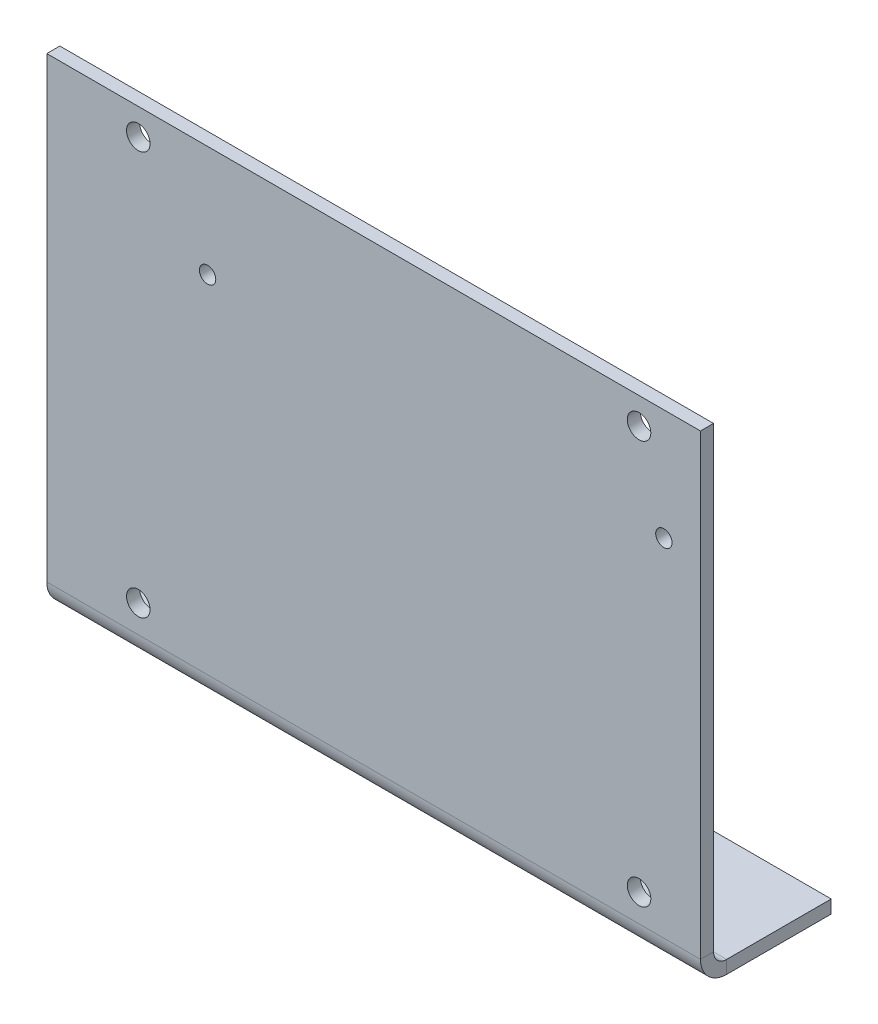
ISO-10303-21;
HEADER;
FILE_DESCRIPTION(('STEP AP214'),'2;1');
FILE_NAME('part.step','',(''),(''),'','','');
FILE_SCHEMA(('AUTOMOTIVE_DESIGN { 1 0 10303 214 1 1 1 1 }'));
ENDSEC;
DATA;
#1=APPLICATION_CONTEXT('core data for automotive mechanical design processes');
#2=APPLICATION_PROTOCOL_DEFINITION('international standard','automotive_design',2000,#1);
#3=PRODUCT_CONTEXT('',#1,'mechanical');
#4=PRODUCT('Part','Part','',(#3));
#5=PRODUCT_RELATED_PRODUCT_CATEGORY('part','',(#4));
#6=PRODUCT_DEFINITION_FORMATION('','',#4);
#7=PRODUCT_DEFINITION_CONTEXT('part definition',#1,'design');
#8=PRODUCT_DEFINITION('design','',#6,#7);
#9=PRODUCT_DEFINITION_SHAPE('','',#8);
#10=(LENGTH_UNIT() NAMED_UNIT(*) SI_UNIT(.MILLI.,.METRE.));
#11=(NAMED_UNIT(*) PLANE_ANGLE_UNIT() SI_UNIT($,.RADIAN.));
#12=(NAMED_UNIT(*) SI_UNIT($,.STERADIAN.) SOLID_ANGLE_UNIT());
#13=UNCERTAINTY_MEASURE_WITH_UNIT(LENGTH_MEASURE(1.E-05),#10,'distance_accuracy_value','');
#14=(GEOMETRIC_REPRESENTATION_CONTEXT(3) GLOBAL_UNCERTAINTY_ASSIGNED_CONTEXT((#13)) GLOBAL_UNIT_ASSIGNED_CONTEXT((#10,
#11,#12)) REPRESENTATION_CONTEXT('',''));
#15=CARTESIAN_POINT('',(0.,0.,0.));
#16=DIRECTION('',(0.,0.,1.));
#17=DIRECTION('',(1.,0.,0.));
#18=AXIS2_PLACEMENT_3D('',#15,#16,#17);
#19=CARTESIAN_POINT('',(0.,0.,10.));
#20=DIRECTION('',(0.,0.,-1.));
#21=DIRECTION('',(-1.,0.,0.));
#22=AXIS2_PLACEMENT_3D('',#19,#20,#21);
#23=PLANE('',#22);
#24=CARTESIAN_POINT('',(-35.9999999999997,67.9350000000002,9.99999999999995));
#25=DIRECTION('',(0.,0.,-1.));
#26=DIRECTION('',(-1.,0.,0.));
#27=AXIS2_PLACEMENT_3D('',#24,#25,#26);
#28=CIRCLE('',#27,1.8);
#29=CARTESIAN_POINT('',(-37.7999999999997,67.9350000000002,9.99999999999995));
#30=VERTEX_POINT('',#29);
#31=EDGE_CURVE('E203',#30,#30,#28,.T.);
#32=ORIENTED_EDGE('',*,*,#31,.T.);
#33=EDGE_LOOP('',(#32));
#34=FACE_BOUND('',#33,.T.);
#35=CARTESIAN_POINT('',(40.6000000000002,67.9349999999999,9.99999999999995));
#36=DIRECTION('',(0.,0.,-1.));
#37=DIRECTION('',(-1.,0.,0.));
#38=AXIS2_PLACEMENT_3D('',#35,#36,#37);
#39=CIRCLE('',#38,1.8);
#40=CARTESIAN_POINT('',(38.8000000000002,67.9349999999999,9.99999999999995));
#41=VERTEX_POINT('',#40);
#42=EDGE_CURVE('E197',#41,#41,#39,.T.);
#43=ORIENTED_EDGE('',*,*,#42,.T.);
#44=EDGE_LOOP('',(#43));
#45=FACE_BOUND('',#44,.T.);
#46=CARTESIAN_POINT('',(40.6,6.21499999999991,9.99999999999995));
#47=DIRECTION('',(0.,0.,-1.));
#48=DIRECTION('',(-1.,0.,0.));
#49=AXIS2_PLACEMENT_3D('',#46,#47,#48);
#50=CIRCLE('',#49,1.8);
#51=CARTESIAN_POINT('',(38.8,6.21499999999991,9.99999999999995));
#52=VERTEX_POINT('',#51);
#53=EDGE_CURVE('E191',#52,#52,#50,.T.);
#54=ORIENTED_EDGE('',*,*,#53,.T.);
#55=EDGE_LOOP('',(#54));
#56=FACE_BOUND('',#55,.T.);
#57=CARTESIAN_POINT('',(-35.9999999999999,6.21500000000017,9.99999999999995));
#58=DIRECTION('',(0.,0.,-1.));
#59=DIRECTION('',(-1.,0.,0.));
#60=AXIS2_PLACEMENT_3D('',#57,#58,#59);
#61=CIRCLE('',#60,1.8);
#62=CARTESIAN_POINT('',(-37.7999999999999,6.21500000000017,9.99999999999995));
#63=VERTEX_POINT('',#62);
#64=EDGE_CURVE('E185',#63,#63,#61,.T.);
#65=ORIENTED_EDGE('',*,*,#64,.T.);
#66=EDGE_LOOP('',(#65));
#67=FACE_BOUND('',#66,.T.);
#68=CARTESIAN_POINT('',(-25.4000000000052,55.0000000002425,10.));
#69=DIRECTION('',(0.,0.,1.));
#70=DIRECTION('',(1.,0.,0.));
#71=AXIS2_PLACEMENT_3D('',#68,#69,#70);
#72=CIRCLE('',#71,1.25);
#73=CARTESIAN_POINT('',(-24.1500000000052,55.0000000002425,10.));
#74=VERTEX_POINT('',#73);
#75=EDGE_CURVE('E182',#74,#74,#72,.T.);
#76=ORIENTED_EDGE('',*,*,#75,.F.);
#77=EDGE_LOOP('',(#76));
#78=FACE_BOUND('',#77,.T.);
#79=DIRECTION('',(1.,0.,0.));
#80=VECTOR('',#79,1.);
#81=CARTESIAN_POINT('',(-50.,1.99999999999999,10.));
#82=LINE('',#81,#80);
#83=CARTESIAN_POINT('',(50.,1.99999999999999,10.));
#84=VERTEX_POINT('',#83);
#85=CARTESIAN_POINT('',(-50.,1.99999999999999,10.));
#86=VERTEX_POINT('',#85);
#87=EDGE_CURVE('E148',#84,#86,#82,.F.);
#88=ORIENTED_EDGE('',*,*,#87,.F.);
#89=DIRECTION('',(0.,1.,0.));
#90=VECTOR('',#89,1.);
#91=CARTESIAN_POINT('',(50.,0.,10.));
#92=LINE('',#91,#90);
#93=CARTESIAN_POINT('',(50.,72.,10.));
#94=VERTEX_POINT('',#93);
#95=EDGE_CURVE('E163',#84,#94,#92,.T.);
#96=ORIENTED_EDGE('',*,*,#95,.T.);
#97=DIRECTION('',(-1.,0.,0.));
#98=VECTOR('',#97,1.);
#99=CARTESIAN_POINT('',(0.,72.,10.));
#100=LINE('',#99,#98);
#101=CARTESIAN_POINT('',(-50.,72.,10.));
#102=VERTEX_POINT('',#101);
#103=EDGE_CURVE('E166',#94,#102,#100,.T.);
#104=ORIENTED_EDGE('',*,*,#103,.T.);
#105=DIRECTION('',(0.,-1.,0.));
#106=VECTOR('',#105,1.);
#107=CARTESIAN_POINT('',(-50.,0.,10.));
#108=LINE('',#107,#106);
#109=EDGE_CURVE('E160',#102,#86,#108,.T.);
#110=ORIENTED_EDGE('',*,*,#109,.T.);
#111=EDGE_LOOP('',(#88,#96,#104,#110));
#112=FACE_BOUND('',#111,.T.);
#113=CARTESIAN_POINT('',(44.3999999999948,55.0000000002425,10.));
#114=DIRECTION('',(0.,0.,1.));
#115=DIRECTION('',(1.,0.,0.));
#116=AXIS2_PLACEMENT_3D('',#113,#114,#115);
#117=CIRCLE('',#116,1.25);
#118=CARTESIAN_POINT('',(45.6499999999948,55.0000000002425,10.));
#119=VERTEX_POINT('',#118);
#120=EDGE_CURVE('E176',#119,#119,#117,.T.);
#121=ORIENTED_EDGE('',*,*,#120,.F.);
#122=EDGE_LOOP('',(#121));
#123=FACE_BOUND('',#122,.T.);
#124=ADVANCED_FACE('F59',(#34,#45,#56,#67,#78,#112,#123),#23,.F.);
#125=CARTESIAN_POINT('',(0.,0.,8.));
#126=DIRECTION('',(0.,0.,-1.));
#127=DIRECTION('',(-1.,0.,0.));
#128=AXIS2_PLACEMENT_3D('',#125,#126,#127);
#129=PLANE('',#128);
#130=CARTESIAN_POINT('',(-35.9999999999997,67.9350000000002,7.99999999999995));
#131=DIRECTION('',(0.,0.,-1.));
#132=DIRECTION('',(-1.,0.,0.));
#133=AXIS2_PLACEMENT_3D('',#130,#131,#132);
#134=CIRCLE('',#133,1.79999999999999);
#135=CARTESIAN_POINT('',(-37.7999999999997,67.9350000000002,7.99999999999995));
#136=VERTEX_POINT('',#135);
#137=EDGE_CURVE('E206',#136,#136,#134,.T.);
#138=ORIENTED_EDGE('',*,*,#137,.F.);
#139=EDGE_LOOP('',(#138));
#140=FACE_BOUND('',#139,.T.);
#141=CARTESIAN_POINT('',(40.6000000000002,67.9349999999999,7.99999999999995));
#142=DIRECTION('',(0.,0.,-1.));
#143=DIRECTION('',(-1.,0.,0.));
#144=AXIS2_PLACEMENT_3D('',#141,#142,#143);
#145=CIRCLE('',#144,1.79999999999999);
#146=CARTESIAN_POINT('',(38.8000000000002,67.9349999999999,7.99999999999995));
#147=VERTEX_POINT('',#146);
#148=EDGE_CURVE('E200',#147,#147,#145,.T.);
#149=ORIENTED_EDGE('',*,*,#148,.F.);
#150=EDGE_LOOP('',(#149));
#151=FACE_BOUND('',#150,.T.);
#152=CARTESIAN_POINT('',(40.6,6.21499999999991,7.99999999999995));
#153=DIRECTION('',(0.,0.,-1.));
#154=DIRECTION('',(-1.,0.,0.));
#155=AXIS2_PLACEMENT_3D('',#152,#153,#154);
#156=CIRCLE('',#155,1.79999999999999);
#157=CARTESIAN_POINT('',(38.8,6.21499999999991,7.99999999999995));
#158=VERTEX_POINT('',#157);
#159=EDGE_CURVE('E194',#158,#158,#156,.T.);
#160=ORIENTED_EDGE('',*,*,#159,.F.);
#161=EDGE_LOOP('',(#160));
#162=FACE_BOUND('',#161,.T.);
#163=CARTESIAN_POINT('',(-35.9999999999999,6.21500000000017,7.99999999999995));
#164=DIRECTION('',(0.,0.,-1.));
#165=DIRECTION('',(-1.,0.,0.));
#166=AXIS2_PLACEMENT_3D('',#163,#164,#165);
#167=CIRCLE('',#166,1.79999999999999);
#168=CARTESIAN_POINT('',(-37.7999999999999,6.21500000000017,7.99999999999995));
#169=VERTEX_POINT('',#168);
#170=EDGE_CURVE('E188',#169,#169,#167,.T.);
#171=ORIENTED_EDGE('',*,*,#170,.F.);
#172=EDGE_LOOP('',(#171));
#173=FACE_BOUND('',#172,.T.);
#174=CARTESIAN_POINT('',(-25.4000000000052,55.0000000002425,8.));
#175=DIRECTION('',(0.,0.,-1.));
#176=DIRECTION('',(-1.,0.,0.));
#177=AXIS2_PLACEMENT_3D('',#174,#175,#176);
#178=CIRCLE('',#177,1.25);
#179=CARTESIAN_POINT('',(-26.6500000000052,55.0000000002425,8.));
#180=VERTEX_POINT('',#179);
#181=EDGE_CURVE('E179',#180,#180,#178,.F.);
#182=ORIENTED_EDGE('',*,*,#181,.T.);
#183=EDGE_LOOP('',(#182));
#184=FACE_BOUND('',#183,.T.);
#185=DIRECTION('',(0.,-1.,0.));
#186=VECTOR('',#185,1.);
#187=CARTESIAN_POINT('',(50.,72.,8.));
#188=LINE('',#187,#186);
#189=CARTESIAN_POINT('',(50.,1.99999999999999,8.));
#190=VERTEX_POINT('',#189);
#191=CARTESIAN_POINT('',(50.,72.,8.));
#192=VERTEX_POINT('',#191);
#193=EDGE_CURVE('E154',#190,#192,#188,.F.);
#194=ORIENTED_EDGE('',*,*,#193,.F.);
#195=DIRECTION('',(1.,0.,0.));
#196=VECTOR('',#195,1.);
#197=CARTESIAN_POINT('',(-50.,1.99999999999999,8.));
#198=LINE('',#197,#196);
#199=CARTESIAN_POINT('',(-50.,1.99999999999999,8.));
#200=VERTEX_POINT('',#199);
#201=EDGE_CURVE('E141',#200,#190,#198,.T.);
#202=ORIENTED_EDGE('',*,*,#201,.F.);
#203=DIRECTION('',(0.,1.,0.));
#204=VECTOR('',#203,1.);
#205=CARTESIAN_POINT('',(-50.,0.,8.));
#206=LINE('',#205,#204);
#207=CARTESIAN_POINT('',(-50.,72.,8.));
#208=VERTEX_POINT('',#207);
#209=EDGE_CURVE('E151',#208,#200,#206,.F.);
#210=ORIENTED_EDGE('',*,*,#209,.F.);
#211=DIRECTION('',(1.,0.,0.));
#212=VECTOR('',#211,1.);
#213=CARTESIAN_POINT('',(-50.,72.,8.));
#214=LINE('',#213,#212);
#215=EDGE_CURVE('E157',#192,#208,#214,.F.);
#216=ORIENTED_EDGE('',*,*,#215,.F.);
#217=EDGE_LOOP('',(#194,#202,#210,#216));
#218=FACE_BOUND('',#217,.T.);
#219=CARTESIAN_POINT('',(44.3999999999948,55.0000000002425,8.));
#220=DIRECTION('',(0.,0.,-1.));
#221=DIRECTION('',(-1.,0.,0.));
#222=AXIS2_PLACEMENT_3D('',#219,#220,#221);
#223=CIRCLE('',#222,1.25);
#224=CARTESIAN_POINT('',(43.1499999999948,55.0000000002425,8.));
#225=VERTEX_POINT('',#224);
#226=EDGE_CURVE('E142',#225,#225,#223,.F.);
#227=ORIENTED_EDGE('',*,*,#226,.T.);
#228=EDGE_LOOP('',(#227));
#229=FACE_BOUND('',#228,.T.);
#230=ADVANCED_FACE('F212',(#140,#151,#162,#173,#184,#218,#229),#129,.T.);
#231=CARTESIAN_POINT('',(50.,-2.,-10.));
#232=DIRECTION('',(1.,0.,0.));
#233=DIRECTION('',(0.,0.,-1.));
#234=AXIS2_PLACEMENT_3D('',#231,#232,#233);
#235=PLANE('',#234);
#236=DIRECTION('',(0.,0.,-1.));
#237=VECTOR('',#236,1.);
#238=CARTESIAN_POINT('',(50.,0.,-10.));
#239=LINE('',#238,#237);
#240=CARTESIAN_POINT('',(50.,0.,6.));
#241=VERTEX_POINT('',#240);
#242=CARTESIAN_POINT('',(50.,0.,-10.));
#243=VERTEX_POINT('',#242);
#244=EDGE_CURVE('E108',#241,#243,#239,.T.);
#245=ORIENTED_EDGE('',*,*,#244,.F.);
#246=DIRECTION('',(0.,-1.,0.));
#247=VECTOR('',#246,1.);
#248=CARTESIAN_POINT('',(50.,0.,6.));
#249=LINE('',#248,#247);
#250=CARTESIAN_POINT('',(50.,-2.00000000000001,6.));
#251=VERTEX_POINT('',#250);
#252=EDGE_CURVE('E117',#241,#251,#249,.T.);
#253=ORIENTED_EDGE('',*,*,#252,.T.);
#254=DIRECTION('',(0.,0.,-1.));
#255=VECTOR('',#254,1.);
#256=CARTESIAN_POINT('',(50.,-2.,-10.));
#257=LINE('',#256,#255);
#258=CARTESIAN_POINT('',(50.,-2.,-10.));
#259=VERTEX_POINT('',#258);
#260=EDGE_CURVE('E105',#251,#259,#257,.T.);
#261=ORIENTED_EDGE('',*,*,#260,.T.);
#262=DIRECTION('',(0.,1.,0.));
#263=VECTOR('',#262,1.);
#264=CARTESIAN_POINT('',(50.,-2.,-10.));
#265=LINE('',#264,#263);
#266=EDGE_CURVE('E63',#259,#243,#265,.T.);
#267=ORIENTED_EDGE('',*,*,#266,.T.);
#268=EDGE_LOOP('',(#245,#253,#261,#267));
#269=FACE_BOUND('',#268,.T.);
#270=ADVANCED_FACE('F61',(#269),#235,.T.);
#271=CARTESIAN_POINT('',(0.,-2.,0.));
#272=DIRECTION('',(0.,1.,0.));
#273=DIRECTION('',(0.,0.,1.));
#274=AXIS2_PLACEMENT_3D('',#271,#272,#273);
#275=PLANE('',#274);
#276=DIRECTION('',(1.,0.,0.));
#277=VECTOR('',#276,1.);
#278=CARTESIAN_POINT('',(50.,-2.00000000000001,6.));
#279=LINE('',#278,#277);
#280=CARTESIAN_POINT('',(-50.,-2.,6.));
#281=VERTEX_POINT('',#280);
#282=EDGE_CURVE('E133',#251,#281,#279,.F.);
#283=ORIENTED_EDGE('',*,*,#282,.T.);
#284=DIRECTION('',(0.,0.,1.));
#285=VECTOR('',#284,1.);
#286=CARTESIAN_POINT('',(-50.,-2.,-10.));
#287=LINE('',#286,#285);
#288=CARTESIAN_POINT('',(-50.,-2.,-10.));
#289=VERTEX_POINT('',#288);
#290=EDGE_CURVE('E113',#289,#281,#287,.T.);
#291=ORIENTED_EDGE('',*,*,#290,.F.);
#292=DIRECTION('',(-1.,0.,0.));
#293=VECTOR('',#292,1.);
#294=CARTESIAN_POINT('',(-50.,-2.,-10.));
#295=LINE('',#294,#293);
#296=EDGE_CURVE('E98',#259,#289,#295,.T.);
#297=ORIENTED_EDGE('',*,*,#296,.F.);
#298=ORIENTED_EDGE('',*,*,#260,.F.);
#299=EDGE_LOOP('',(#283,#291,#297,#298));
#300=FACE_BOUND('',#299,.T.);
#301=ADVANCED_FACE('F274',(#300),#275,.F.);
#302=CARTESIAN_POINT('',(0.,0.,0.));
#303=DIRECTION('',(0.,1.,0.));
#304=DIRECTION('',(0.,0.,1.));
#305=AXIS2_PLACEMENT_3D('',#302,#303,#304);
#306=PLANE('',#305);
#307=DIRECTION('',(0.,0.,1.));
#308=VECTOR('',#307,1.);
#309=CARTESIAN_POINT('',(-50.,0.,-10.));
#310=LINE('',#309,#308);
#311=CARTESIAN_POINT('',(-50.,0.,-10.));
#312=VERTEX_POINT('',#311);
#313=CARTESIAN_POINT('',(-50.,0.,6.));
#314=VERTEX_POINT('',#313);
#315=EDGE_CURVE('E100',#312,#314,#310,.T.);
#316=ORIENTED_EDGE('',*,*,#315,.T.);
#317=DIRECTION('',(1.,0.,0.));
#318=VECTOR('',#317,1.);
#319=CARTESIAN_POINT('',(50.,0.,6.));
#320=LINE('',#319,#318);
#321=EDGE_CURVE('E74',#241,#314,#320,.F.);
#322=ORIENTED_EDGE('',*,*,#321,.F.);
#323=ORIENTED_EDGE('',*,*,#244,.T.);
#324=DIRECTION('',(-1.,0.,0.));
#325=VECTOR('',#324,1.);
#326=CARTESIAN_POINT('',(-50.,0.,-10.));
#327=LINE('',#326,#325);
#328=EDGE_CURVE('E96',#243,#312,#327,.T.);
#329=ORIENTED_EDGE('',*,*,#328,.T.);
#330=EDGE_LOOP('',(#316,#322,#323,#329));
#331=FACE_BOUND('',#330,.T.);
#332=ADVANCED_FACE('F107',(#331),#306,.T.);
#333=CARTESIAN_POINT('',(-50.,-2.,-10.));
#334=DIRECTION('',(-1.,0.,0.));
#335=DIRECTION('',(0.,0.,1.));
#336=AXIS2_PLACEMENT_3D('',#333,#334,#335);
#337=PLANE('',#336);
#338=DIRECTION('',(0.,-1.,0.));
#339=VECTOR('',#338,1.);
#340=CARTESIAN_POINT('',(-50.,0.,6.));
#341=LINE('',#340,#339);
#342=EDGE_CURVE('E104',#314,#281,#341,.T.);
#343=ORIENTED_EDGE('',*,*,#342,.F.);
#344=ORIENTED_EDGE('',*,*,#315,.F.);
#345=DIRECTION('',(0.,1.,0.));
#346=VECTOR('',#345,1.);
#347=CARTESIAN_POINT('',(-50.,-2.,-10.));
#348=LINE('',#347,#346);
#349=EDGE_CURVE('E13',#289,#312,#348,.T.);
#350=ORIENTED_EDGE('',*,*,#349,.F.);
#351=ORIENTED_EDGE('',*,*,#290,.T.);
#352=EDGE_LOOP('',(#343,#344,#350,#351));
#353=FACE_BOUND('',#352,.T.);
#354=ADVANCED_FACE('F101',(#353),#337,.T.);
#355=CARTESIAN_POINT('',(-50.,-2.,-10.));
#356=DIRECTION('',(0.,0.,-1.));
#357=DIRECTION('',(-1.,0.,0.));
#358=AXIS2_PLACEMENT_3D('',#355,#356,#357);
#359=PLANE('',#358);
#360=ORIENTED_EDGE('',*,*,#328,.F.);
#361=ORIENTED_EDGE('',*,*,#266,.F.);
#362=ORIENTED_EDGE('',*,*,#296,.T.);
#363=ORIENTED_EDGE('',*,*,#349,.T.);
#364=EDGE_LOOP('',(#360,#361,#362,#363));
#365=FACE_BOUND('',#364,.T.);
#366=ADVANCED_FACE('F93',(#365),#359,.T.);
#367=CARTESIAN_POINT('',(-50.,1.99999999999999,6.));
#368=DIRECTION('',(-1.,0.,0.));
#369=DIRECTION('',(0.,0.,1.));
#370=AXIS2_PLACEMENT_3D('',#367,#368,#369);
#371=PLANE('',#370);
#372=DIRECTION('',(0.,0.,-1.));
#373=VECTOR('',#372,1.);
#374=CARTESIAN_POINT('',(-50.,1.99999999999999,10.));
#375=LINE('',#374,#373);
#376=EDGE_CURVE('E138',#200,#86,#375,.F.);
#377=ORIENTED_EDGE('',*,*,#376,.F.);
#378=CARTESIAN_POINT('',(-50.,1.99999999999999,6.));
#379=DIRECTION('',(1.,0.,0.));
#380=DIRECTION('',(0.,0.,-1.));
#381=AXIS2_PLACEMENT_3D('',#378,#379,#380);
#382=CIRCLE('',#381,2.);
#383=EDGE_CURVE('E127',#314,#200,#382,.F.);
#384=ORIENTED_EDGE('',*,*,#383,.F.);
#385=ORIENTED_EDGE('',*,*,#342,.T.);
#386=CARTESIAN_POINT('',(-50.,1.99999999999999,6.));
#387=DIRECTION('',(1.,0.,0.));
#388=DIRECTION('',(0.,0.,-1.));
#389=AXIS2_PLACEMENT_3D('',#386,#387,#388);
#390=CIRCLE('',#389,4.);
#391=EDGE_CURVE('E120',#281,#86,#390,.F.);
#392=ORIENTED_EDGE('',*,*,#391,.T.);
#393=EDGE_LOOP('',(#377,#384,#385,#392));
#394=FACE_BOUND('',#393,.T.);
#395=ADVANCED_FACE('F267',(#394),#371,.T.);
#396=CARTESIAN_POINT('',(50.,1.99999999999999,6.));
#397=DIRECTION('',(-1.,0.,0.));
#398=DIRECTION('',(0.,0.,1.));
#399=AXIS2_PLACEMENT_3D('',#396,#397,#398);
#400=PLANE('',#399);
#401=CARTESIAN_POINT('',(50.,1.99999999999999,6.));
#402=DIRECTION('',(1.,0.,0.));
#403=DIRECTION('',(0.,0.,-1.));
#404=AXIS2_PLACEMENT_3D('',#401,#402,#403);
#405=CIRCLE('',#404,2.);
#406=EDGE_CURVE('E122',#190,#241,#405,.T.);
#407=ORIENTED_EDGE('',*,*,#406,.F.);
#408=DIRECTION('',(0.,0.,-1.));
#409=VECTOR('',#408,1.);
#410=CARTESIAN_POINT('',(50.,1.99999999999999,8.00000000000001));
#411=LINE('',#410,#409);
#412=EDGE_CURVE('E145',#190,#84,#411,.F.);
#413=ORIENTED_EDGE('',*,*,#412,.T.);
#414=CARTESIAN_POINT('',(50.,1.99999999999999,6.));
#415=DIRECTION('',(1.,0.,0.));
#416=DIRECTION('',(0.,0.,-1.));
#417=AXIS2_PLACEMENT_3D('',#414,#415,#416);
#418=CIRCLE('',#417,4.);
#419=EDGE_CURVE('E130',#84,#251,#418,.T.);
#420=ORIENTED_EDGE('',*,*,#419,.T.);
#421=ORIENTED_EDGE('',*,*,#252,.F.);
#422=EDGE_LOOP('',(#407,#413,#420,#421));
#423=FACE_BOUND('',#422,.T.);
#424=ADVANCED_FACE('F262',(#423),#400,.F.);
#425=CARTESIAN_POINT('',(50.,1.99999999999999,6.));
#426=DIRECTION('',(1.,0.,0.));
#427=DIRECTION('',(0.,0.,1.));
#428=AXIS2_PLACEMENT_3D('',#425,#426,#427);
#429=CYLINDRICAL_SURFACE('',#428,4.);
#430=ORIENTED_EDGE('',*,*,#282,.F.);
#431=ORIENTED_EDGE('',*,*,#419,.F.);
#432=ORIENTED_EDGE('',*,*,#87,.T.);
#433=ORIENTED_EDGE('',*,*,#391,.F.);
#434=EDGE_LOOP('',(#430,#431,#432,#433));
#435=FACE_BOUND('',#434,.T.);
#436=ADVANCED_FACE('F259',(#435),#429,.T.);
#437=CARTESIAN_POINT('',(50.,1.99999999999999,6.));
#438=DIRECTION('',(1.,0.,0.));
#439=DIRECTION('',(0.,0.,1.));
#440=AXIS2_PLACEMENT_3D('',#437,#438,#439);
#441=CYLINDRICAL_SURFACE('',#440,2.);
#442=ORIENTED_EDGE('',*,*,#321,.T.);
#443=ORIENTED_EDGE('',*,*,#383,.T.);
#444=ORIENTED_EDGE('',*,*,#201,.T.);
#445=ORIENTED_EDGE('',*,*,#406,.T.);
#446=EDGE_LOOP('',(#442,#443,#444,#445));
#447=FACE_BOUND('',#446,.T.);
#448=ADVANCED_FACE('F257',(#447),#441,.F.);
#449=CARTESIAN_POINT('',(-50.,0.,10.));
#450=DIRECTION('',(1.,0.,0.));
#451=DIRECTION('',(0.,0.,-1.));
#452=AXIS2_PLACEMENT_3D('',#449,#450,#451);
#453=PLANE('',#452);
#454=ORIENTED_EDGE('',*,*,#376,.T.);
#455=ORIENTED_EDGE('',*,*,#109,.F.);
#456=DIRECTION('',(0.,0.,-1.));
#457=VECTOR('',#456,1.);
#458=CARTESIAN_POINT('',(-50.,72.,10.));
#459=LINE('',#458,#457);
#460=EDGE_CURVE('E169',#102,#208,#459,.T.);
#461=ORIENTED_EDGE('',*,*,#460,.T.);
#462=ORIENTED_EDGE('',*,*,#209,.T.);
#463=EDGE_LOOP('',(#454,#455,#461,#462));
#464=FACE_BOUND('',#463,.T.);
#465=ADVANCED_FACE('F253',(#464),#453,.F.);
#466=CARTESIAN_POINT('',(50.,72.,10.));
#467=DIRECTION('',(-1.,0.,0.));
#468=DIRECTION('',(0.,-1.,0.));
#469=AXIS2_PLACEMENT_3D('',#466,#467,#468);
#470=PLANE('',#469);
#471=ORIENTED_EDGE('',*,*,#412,.F.);
#472=ORIENTED_EDGE('',*,*,#193,.T.);
#473=DIRECTION('',(0.,0.,-1.));
#474=VECTOR('',#473,1.);
#475=CARTESIAN_POINT('',(50.,72.,10.));
#476=LINE('',#475,#474);
#477=EDGE_CURVE('E125',#94,#192,#476,.T.);
#478=ORIENTED_EDGE('',*,*,#477,.F.);
#479=ORIENTED_EDGE('',*,*,#95,.F.);
#480=EDGE_LOOP('',(#471,#472,#478,#479));
#481=FACE_BOUND('',#480,.T.);
#482=ADVANCED_FACE('F249',(#481),#470,.F.);
#483=CARTESIAN_POINT('',(-50.,72.,10.));
#484=DIRECTION('',(0.,-1.,0.));
#485=DIRECTION('',(0.,0.,-1.));
#486=AXIS2_PLACEMENT_3D('',#483,#484,#485);
#487=PLANE('',#486);
#488=ORIENTED_EDGE('',*,*,#215,.T.);
#489=ORIENTED_EDGE('',*,*,#460,.F.);
#490=ORIENTED_EDGE('',*,*,#103,.F.);
#491=ORIENTED_EDGE('',*,*,#477,.T.);
#492=EDGE_LOOP('',(#488,#489,#490,#491));
#493=FACE_BOUND('',#492,.T.);
#494=ADVANCED_FACE('F235',(#493),#487,.F.);
#495=CARTESIAN_POINT('',(44.3999999999948,55.0000000002425,10.));
#496=DIRECTION('',(0.,0.,1.));
#497=DIRECTION('',(1.,0.,0.));
#498=AXIS2_PLACEMENT_3D('',#495,#496,#497);
#499=CYLINDRICAL_SURFACE('',#498,1.25);
#500=ORIENTED_EDGE('',*,*,#226,.F.);
#501=EDGE_LOOP('',(#500));
#502=FACE_BOUND('',#501,.T.);
#503=ORIENTED_EDGE('',*,*,#120,.T.);
#504=EDGE_LOOP('',(#503));
#505=FACE_BOUND('',#504,.T.);
#506=ADVANCED_FACE('F231',(#502,#505),#499,.F.);
#507=CARTESIAN_POINT('',(-25.4000000000052,55.0000000002425,10.));
#508=DIRECTION('',(0.,0.,1.));
#509=DIRECTION('',(1.,0.,0.));
#510=AXIS2_PLACEMENT_3D('',#507,#508,#509);
#511=CYLINDRICAL_SURFACE('',#510,1.25);
#512=ORIENTED_EDGE('',*,*,#181,.F.);
#513=EDGE_LOOP('',(#512));
#514=FACE_BOUND('',#513,.T.);
#515=ORIENTED_EDGE('',*,*,#75,.T.);
#516=EDGE_LOOP('',(#515));
#517=FACE_BOUND('',#516,.T.);
#518=ADVANCED_FACE('F234',(#514,#517),#511,.F.);
#519=CARTESIAN_POINT('',(-35.9999999999999,6.21500000000017,7.99999999999995));
#520=DIRECTION('',(0.,0.,-1.));
#521=DIRECTION('',(-1.,0.,0.));
#522=AXIS2_PLACEMENT_3D('',#519,#520,#521);
#523=CYLINDRICAL_SURFACE('',#522,1.79999999999999);
#524=ORIENTED_EDGE('',*,*,#64,.F.);
#525=EDGE_LOOP('',(#524));
#526=FACE_BOUND('',#525,.T.);
#527=ORIENTED_EDGE('',*,*,#170,.T.);
#528=EDGE_LOOP('',(#527));
#529=FACE_BOUND('',#528,.T.);
#530=ADVANCED_FACE('F325',(#526,#529),#523,.F.);
#531=CARTESIAN_POINT('',(40.6,6.21499999999991,7.99999999999995));
#532=DIRECTION('',(0.,0.,-1.));
#533=DIRECTION('',(-1.,0.,0.));
#534=AXIS2_PLACEMENT_3D('',#531,#532,#533);
#535=CYLINDRICAL_SURFACE('',#534,1.79999999999999);
#536=ORIENTED_EDGE('',*,*,#53,.F.);
#537=EDGE_LOOP('',(#536));
#538=FACE_BOUND('',#537,.T.);
#539=ORIENTED_EDGE('',*,*,#159,.T.);
#540=EDGE_LOOP('',(#539));
#541=FACE_BOUND('',#540,.T.);
#542=ADVANCED_FACE('F332',(#538,#541),#535,.F.);
#543=CARTESIAN_POINT('',(40.6000000000002,67.9349999999999,7.99999999999995));
#544=DIRECTION('',(0.,0.,-1.));
#545=DIRECTION('',(-1.,0.,0.));
#546=AXIS2_PLACEMENT_3D('',#543,#544,#545);
#547=CYLINDRICAL_SURFACE('',#546,1.79999999999999);
#548=ORIENTED_EDGE('',*,*,#42,.F.);
#549=EDGE_LOOP('',(#548));
#550=FACE_BOUND('',#549,.T.);
#551=ORIENTED_EDGE('',*,*,#148,.T.);
#552=EDGE_LOOP('',(#551));
#553=FACE_BOUND('',#552,.T.);
#554=ADVANCED_FACE('F341',(#550,#553),#547,.F.);
#555=CARTESIAN_POINT('',(-35.9999999999997,67.9350000000002,7.99999999999995));
#556=DIRECTION('',(0.,0.,-1.));
#557=DIRECTION('',(-1.,0.,0.));
#558=AXIS2_PLACEMENT_3D('',#555,#556,#557);
#559=CYLINDRICAL_SURFACE('',#558,1.79999999999999);
#560=ORIENTED_EDGE('',*,*,#31,.F.);
#561=EDGE_LOOP('',(#560));
#562=FACE_BOUND('',#561,.T.);
#563=ORIENTED_EDGE('',*,*,#137,.T.);
#564=EDGE_LOOP('',(#563));
#565=FACE_BOUND('',#564,.T.);
#566=ADVANCED_FACE('F210',(#562,#565),#559,.F.);
#567=CLOSED_SHELL('',(#124,#230,#270,#301,#332,#354,#366,#395,#424,#436,#448,#465,#482,#494,
#506,#518,#530,#542,#554,#566));
#568=MANIFOLD_SOLID_BREP('B2',#567);
#569=ADVANCED_BREP_SHAPE_REPRESENTATION('',(#18,#568),#14);
#570=SHAPE_DEFINITION_REPRESENTATION(#9,#569);
ENDSEC;
END-ISO-10303-21;
